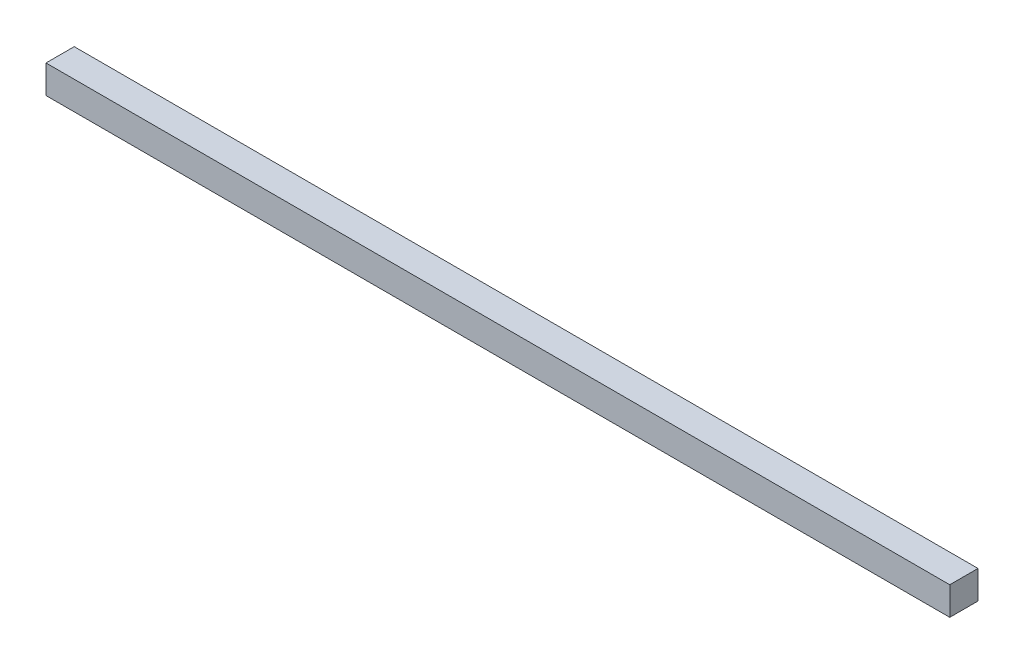
ISO-10303-21;
HEADER;
FILE_DESCRIPTION(('STEP AP214'),'2;1');
FILE_NAME('part.step','',(''),(''),'','','');
FILE_SCHEMA(('AUTOMOTIVE_DESIGN { 1 0 10303 214 1 1 1 1 }'));
ENDSEC;
DATA;
#1=APPLICATION_CONTEXT('core data for automotive mechanical design processes');
#2=APPLICATION_PROTOCOL_DEFINITION('international standard','automotive_design',2000,#1);
#3=PRODUCT_CONTEXT('',#1,'mechanical');
#4=PRODUCT('Part','Part','',(#3));
#5=PRODUCT_RELATED_PRODUCT_CATEGORY('part','',(#4));
#6=PRODUCT_DEFINITION_FORMATION('','',#4);
#7=PRODUCT_DEFINITION_CONTEXT('part definition',#1,'design');
#8=PRODUCT_DEFINITION('design','',#6,#7);
#9=PRODUCT_DEFINITION_SHAPE('','',#8);
#10=(LENGTH_UNIT() NAMED_UNIT(*) SI_UNIT(.MILLI.,.METRE.));
#11=(NAMED_UNIT(*) PLANE_ANGLE_UNIT() SI_UNIT($,.RADIAN.));
#12=(NAMED_UNIT(*) SI_UNIT($,.STERADIAN.) SOLID_ANGLE_UNIT());
#13=UNCERTAINTY_MEASURE_WITH_UNIT(LENGTH_MEASURE(1.E-05),#10,'distance_accuracy_value','');
#14=(GEOMETRIC_REPRESENTATION_CONTEXT(3) GLOBAL_UNCERTAINTY_ASSIGNED_CONTEXT((#13)) GLOBAL_UNIT_ASSIGNED_CONTEXT((#10,
#11,#12)) REPRESENTATION_CONTEXT('',''));
#15=CARTESIAN_POINT('',(0.,0.,0.));
#16=DIRECTION('',(0.,0.,1.));
#17=DIRECTION('',(1.,0.,0.));
#18=AXIS2_PLACEMENT_3D('',#15,#16,#17);
#19=CARTESIAN_POINT('',(-609.6,19.0500000000001,38.1));
#20=DIRECTION('',(1.,0.,0.));
#21=DIRECTION('',(0.,0.,-1.));
#22=AXIS2_PLACEMENT_3D('',#19,#20,#21);
#23=PLANE('',#22);
#24=DIRECTION('',(0.,-1.,0.));
#25=VECTOR('',#24,1.);
#26=CARTESIAN_POINT('',(-609.6,19.0500000000001,0.));
#27=LINE('',#26,#25);
#28=CARTESIAN_POINT('',(-609.6,19.0500000000001,0.));
#29=VERTEX_POINT('',#28);
#30=CARTESIAN_POINT('',(-609.6,-19.0500000000001,0.));
#31=VERTEX_POINT('',#30);
#32=EDGE_CURVE('E95',#29,#31,#27,.T.);
#33=ORIENTED_EDGE('',*,*,#32,.T.);
#34=DIRECTION('',(0.,0.,-1.));
#35=VECTOR('',#34,1.);
#36=CARTESIAN_POINT('',(-609.6,-19.0500000000001,38.1));
#37=LINE('',#36,#35);
#38=CARTESIAN_POINT('',(-609.6,-19.0500000000001,38.1));
#39=VERTEX_POINT('',#38);
#40=EDGE_CURVE('E11',#39,#31,#37,.T.);
#41=ORIENTED_EDGE('',*,*,#40,.F.);
#42=DIRECTION('',(0.,-1.,0.));
#43=VECTOR('',#42,1.);
#44=CARTESIAN_POINT('',(-609.6,19.0500000000001,38.1));
#45=LINE('',#44,#43);
#46=CARTESIAN_POINT('',(-609.6,19.0500000000001,38.1));
#47=VERTEX_POINT('',#46);
#48=EDGE_CURVE('E83',#47,#39,#45,.T.);
#49=ORIENTED_EDGE('',*,*,#48,.F.);
#50=DIRECTION('',(0.,0.,-1.));
#51=VECTOR('',#50,1.);
#52=CARTESIAN_POINT('',(-609.6,19.0500000000001,38.1));
#53=LINE('',#52,#51);
#54=EDGE_CURVE('E91',#47,#29,#53,.T.);
#55=ORIENTED_EDGE('',*,*,#54,.T.);
#56=EDGE_LOOP('',(#33,#41,#49,#55));
#57=FACE_BOUND('',#56,.T.);
#58=ADVANCED_FACE('F32',(#57),#23,.F.);
#59=CARTESIAN_POINT('',(-609.6,-19.0500000000001,38.1));
#60=DIRECTION('',(0.,1.,0.));
#61=DIRECTION('',(-1.,0.,0.));
#62=AXIS2_PLACEMENT_3D('',#59,#60,#61);
#63=PLANE('',#62);
#64=DIRECTION('',(1.,0.,0.));
#65=VECTOR('',#64,1.);
#66=CARTESIAN_POINT('',(-609.6,-19.0500000000001,0.));
#67=LINE('',#66,#65);
#68=CARTESIAN_POINT('',(609.6,-19.05,0.));
#69=VERTEX_POINT('',#68);
#70=EDGE_CURVE('E87',#31,#69,#67,.T.);
#71=ORIENTED_EDGE('',*,*,#70,.T.);
#72=DIRECTION('',(0.,0.,-1.));
#73=VECTOR('',#72,1.);
#74=CARTESIAN_POINT('',(609.6,-19.05,38.1));
#75=LINE('',#74,#73);
#76=CARTESIAN_POINT('',(609.6,-19.05,38.1));
#77=VERTEX_POINT('',#76);
#78=EDGE_CURVE('E40',#77,#69,#75,.T.);
#79=ORIENTED_EDGE('',*,*,#78,.F.);
#80=DIRECTION('',(1.,0.,0.));
#81=VECTOR('',#80,1.);
#82=CARTESIAN_POINT('',(-609.6,-19.0500000000001,38.1));
#83=LINE('',#82,#81);
#84=EDGE_CURVE('E78',#39,#77,#83,.T.);
#85=ORIENTED_EDGE('',*,*,#84,.F.);
#86=ORIENTED_EDGE('',*,*,#40,.T.);
#87=EDGE_LOOP('',(#71,#79,#85,#86));
#88=FACE_BOUND('',#87,.T.);
#89=ADVANCED_FACE('F86',(#88),#63,.F.);
#90=CARTESIAN_POINT('',(609.6,19.05,38.1));
#91=DIRECTION('',(-1.,0.,0.));
#92=DIRECTION('',(0.,0.,1.));
#93=AXIS2_PLACEMENT_3D('',#90,#91,#92);
#94=PLANE('',#93);
#95=DIRECTION('',(0.,1.,0.));
#96=VECTOR('',#95,1.);
#97=CARTESIAN_POINT('',(609.6,19.05,0.));
#98=LINE('',#97,#96);
#99=CARTESIAN_POINT('',(609.6,19.05,0.));
#100=VERTEX_POINT('',#99);
#101=EDGE_CURVE('E65',#69,#100,#98,.T.);
#102=ORIENTED_EDGE('',*,*,#101,.T.);
#103=DIRECTION('',(0.,0.,-1.));
#104=VECTOR('',#103,1.);
#105=CARTESIAN_POINT('',(609.6,19.05,38.1));
#106=LINE('',#105,#104);
#107=CARTESIAN_POINT('',(609.6,19.05,38.1));
#108=VERTEX_POINT('',#107);
#109=EDGE_CURVE('E88',#108,#100,#106,.T.);
#110=ORIENTED_EDGE('',*,*,#109,.F.);
#111=DIRECTION('',(0.,1.,0.));
#112=VECTOR('',#111,1.);
#113=CARTESIAN_POINT('',(609.6,19.05,38.1));
#114=LINE('',#113,#112);
#115=EDGE_CURVE('E81',#77,#108,#114,.T.);
#116=ORIENTED_EDGE('',*,*,#115,.F.);
#117=ORIENTED_EDGE('',*,*,#78,.T.);
#118=EDGE_LOOP('',(#102,#110,#116,#117));
#119=FACE_BOUND('',#118,.T.);
#120=ADVANCED_FACE('F89',(#119),#94,.F.);
#121=CARTESIAN_POINT('',(-609.6,19.0500000000001,38.1));
#122=DIRECTION('',(0.,-1.,0.));
#123=DIRECTION('',(1.,0.,0.));
#124=AXIS2_PLACEMENT_3D('',#121,#122,#123);
#125=PLANE('',#124);
#126=DIRECTION('',(-1.,0.,0.));
#127=VECTOR('',#126,1.);
#128=CARTESIAN_POINT('',(-609.6,19.0500000000001,0.));
#129=LINE('',#128,#127);
#130=EDGE_CURVE('E71',#100,#29,#129,.T.);
#131=ORIENTED_EDGE('',*,*,#130,.T.);
#132=ORIENTED_EDGE('',*,*,#54,.F.);
#133=DIRECTION('',(-1.,0.,0.));
#134=VECTOR('',#133,1.);
#135=CARTESIAN_POINT('',(-609.6,19.0500000000001,38.1));
#136=LINE('',#135,#134);
#137=EDGE_CURVE('E48',#108,#47,#136,.T.);
#138=ORIENTED_EDGE('',*,*,#137,.F.);
#139=ORIENTED_EDGE('',*,*,#109,.T.);
#140=EDGE_LOOP('',(#131,#132,#138,#139));
#141=FACE_BOUND('',#140,.T.);
#142=ADVANCED_FACE('F102',(#141),#125,.F.);
#143=CARTESIAN_POINT('',(0.,0.,38.1));
#144=DIRECTION('',(0.,0.,1.));
#145=DIRECTION('',(1.,0.,0.));
#146=AXIS2_PLACEMENT_3D('',#143,#144,#145);
#147=PLANE('',#146);
#148=ORIENTED_EDGE('',*,*,#48,.T.);
#149=ORIENTED_EDGE('',*,*,#84,.T.);
#150=ORIENTED_EDGE('',*,*,#115,.T.);
#151=ORIENTED_EDGE('',*,*,#137,.T.);
#152=EDGE_LOOP('',(#148,#149,#150,#151));
#153=FACE_BOUND('',#152,.T.);
#154=ADVANCED_FACE('F79',(#153),#147,.T.);
#155=CARTESIAN_POINT('',(0.,0.,0.));
#156=DIRECTION('',(0.,0.,1.));
#157=DIRECTION('',(1.,0.,0.));
#158=AXIS2_PLACEMENT_3D('',#155,#156,#157);
#159=PLANE('',#158);
#160=ORIENTED_EDGE('',*,*,#32,.F.);
#161=ORIENTED_EDGE('',*,*,#130,.F.);
#162=ORIENTED_EDGE('',*,*,#101,.F.);
#163=ORIENTED_EDGE('',*,*,#70,.F.);
#164=EDGE_LOOP('',(#160,#161,#162,#163));
#165=FACE_BOUND('',#164,.T.);
#166=ADVANCED_FACE('F105',(#165),#159,.F.);
#167=CLOSED_SHELL('',(#58,#89,#120,#142,#154,#166));
#168=MANIFOLD_SOLID_BREP('B2',#167);
#169=ADVANCED_BREP_SHAPE_REPRESENTATION('',(#18,#168),#14);
#170=SHAPE_DEFINITION_REPRESENTATION(#9,#169);
ENDSEC;
END-ISO-10303-21;
